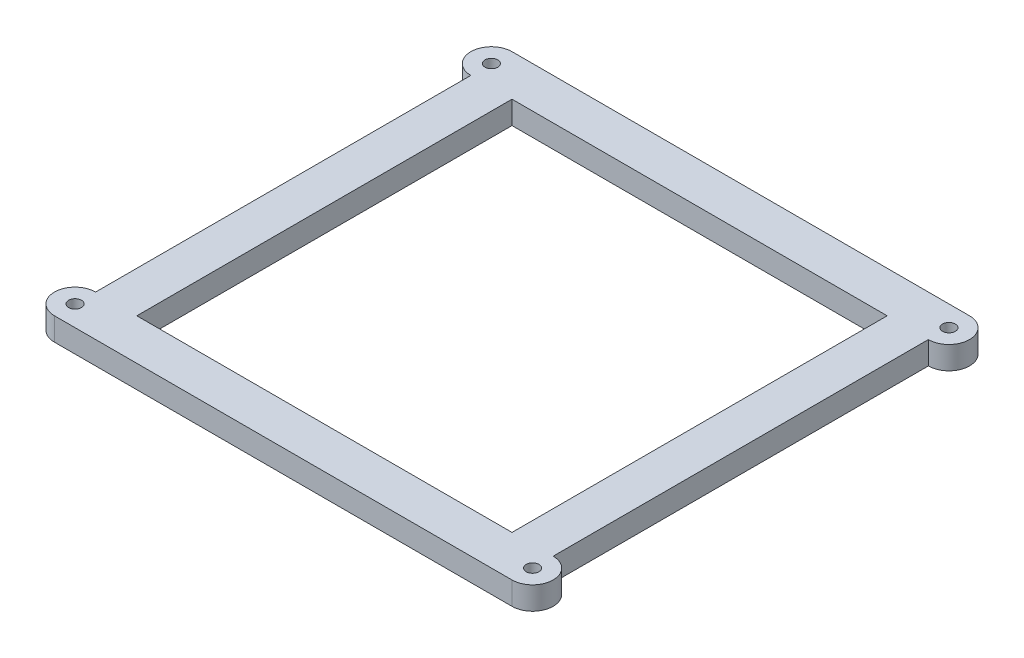
ISO-10303-21;
HEADER;
FILE_DESCRIPTION(('STEP AP214'),'2;1');
FILE_NAME('part.step','',(''),(''),'','','');
FILE_SCHEMA(('AUTOMOTIVE_DESIGN { 1 0 10303 214 1 1 1 1 }'));
ENDSEC;
DATA;
#1=APPLICATION_CONTEXT('core data for automotive mechanical design processes');
#2=APPLICATION_PROTOCOL_DEFINITION('international standard','automotive_design',2000,#1);
#3=PRODUCT_CONTEXT('',#1,'mechanical');
#4=PRODUCT('Part','Part','',(#3));
#5=PRODUCT_RELATED_PRODUCT_CATEGORY('part','',(#4));
#6=PRODUCT_DEFINITION_FORMATION('','',#4);
#7=PRODUCT_DEFINITION_CONTEXT('part definition',#1,'design');
#8=PRODUCT_DEFINITION('design','',#6,#7);
#9=PRODUCT_DEFINITION_SHAPE('','',#8);
#10=(LENGTH_UNIT() NAMED_UNIT(*) SI_UNIT(.MILLI.,.METRE.));
#11=(NAMED_UNIT(*) PLANE_ANGLE_UNIT() SI_UNIT($,.RADIAN.));
#12=(NAMED_UNIT(*) SI_UNIT($,.STERADIAN.) SOLID_ANGLE_UNIT());
#13=UNCERTAINTY_MEASURE_WITH_UNIT(LENGTH_MEASURE(1.E-05),#10,'distance_accuracy_value','');
#14=(GEOMETRIC_REPRESENTATION_CONTEXT(3) GLOBAL_UNCERTAINTY_ASSIGNED_CONTEXT((#13)) GLOBAL_UNIT_ASSIGNED_CONTEXT((#10,
#11,#12)) REPRESENTATION_CONTEXT('',''));
#15=CARTESIAN_POINT('',(0.,0.,0.));
#16=DIRECTION('',(0.,0.,1.));
#17=DIRECTION('',(1.,0.,0.));
#18=AXIS2_PLACEMENT_3D('',#15,#16,#17);
#19=CARTESIAN_POINT('',(0.,3.175,-2.8575));
#20=DIRECTION('',(0.,-1.,0.));
#21=DIRECTION('',(0.,0.,-1.));
#22=AXIS2_PLACEMENT_3D('',#19,#20,#21);
#23=PLANE('',#22);
#24=CARTESIAN_POINT('',(63.5,3.175,-60.6425));
#25=DIRECTION('',(0.,-1.,0.));
#26=DIRECTION('',(0.,0.,-1.));
#27=AXIS2_PLACEMENT_3D('',#24,#25,#26);
#28=CIRCLE('',#27,0.888636505741465);
#29=CARTESIAN_POINT('',(63.5,3.175,-61.5311365057415));
#30=VERTEX_POINT('',#29);
#31=EDGE_CURVE('E36',#30,#30,#28,.T.);
#32=ORIENTED_EDGE('',*,*,#31,.T.);
#33=EDGE_LOOP('',(#32));
#34=FACE_BOUND('',#33,.T.);
#35=CARTESIAN_POINT('',(0.,3.175,-60.6425));
#36=DIRECTION('',(0.,-1.,0.));
#37=DIRECTION('',(0.,0.,-1.));
#38=AXIS2_PLACEMENT_3D('',#35,#36,#37);
#39=CIRCLE('',#38,0.888636505741464);
#40=CARTESIAN_POINT('',(0.,3.175,-61.5311365057415));
#41=VERTEX_POINT('',#40);
#42=EDGE_CURVE('E221',#41,#41,#39,.T.);
#43=ORIENTED_EDGE('',*,*,#42,.T.);
#44=EDGE_LOOP('',(#43));
#45=FACE_BOUND('',#44,.T.);
#46=CARTESIAN_POINT('',(0.,3.175,-2.8575));
#47=DIRECTION('',(0.,-1.,0.));
#48=DIRECTION('',(0.,0.,-1.));
#49=AXIS2_PLACEMENT_3D('',#46,#47,#48);
#50=CIRCLE('',#49,0.888636505741464);
#51=CARTESIAN_POINT('',(0.,3.175,-3.74613650574146));
#52=VERTEX_POINT('',#51);
#53=EDGE_CURVE('E217',#52,#52,#50,.T.);
#54=ORIENTED_EDGE('',*,*,#53,.T.);
#55=EDGE_LOOP('',(#54));
#56=FACE_BOUND('',#55,.T.);
#57=CARTESIAN_POINT('',(63.5,3.175,-2.8575));
#58=DIRECTION('',(0.,-1.,0.));
#59=DIRECTION('',(0.,0.,-1.));
#60=AXIS2_PLACEMENT_3D('',#57,#58,#59);
#61=CIRCLE('',#60,0.888636505741465);
#62=CARTESIAN_POINT('',(63.5,3.175,-3.74613650574146));
#63=VERTEX_POINT('',#62);
#64=EDGE_CURVE('E151',#63,#63,#61,.T.);
#65=ORIENTED_EDGE('',*,*,#64,.T.);
#66=EDGE_LOOP('',(#65));
#67=FACE_BOUND('',#66,.T.);
#68=CARTESIAN_POINT('',(0.,3.175,-2.8575));
#69=DIRECTION('',(0.,1.,0.));
#70=DIRECTION('',(0.,0.,-1.));
#71=AXIS2_PLACEMENT_3D('',#68,#69,#70);
#72=CIRCLE('',#71,2.8575);
#73=CARTESIAN_POINT('',(0.,3.175,-5.715));
#74=VERTEX_POINT('',#73);
#75=CARTESIAN_POINT('',(0.,3.175,0.));
#76=VERTEX_POINT('',#75);
#77=EDGE_CURVE('E161',#74,#76,#72,.T.);
#78=ORIENTED_EDGE('',*,*,#77,.T.);
#79=DIRECTION('',(1.,0.,0.));
#80=VECTOR('',#79,1.);
#81=CARTESIAN_POINT('',(0.,3.175,0.));
#82=LINE('',#81,#80);
#83=CARTESIAN_POINT('',(63.5,3.175,0.));
#84=VERTEX_POINT('',#83);
#85=EDGE_CURVE('E164',#76,#84,#82,.T.);
#86=ORIENTED_EDGE('',*,*,#85,.T.);
#87=CARTESIAN_POINT('',(63.5,3.175,-2.8575));
#88=DIRECTION('',(0.,1.,0.));
#89=DIRECTION('',(0.,0.,1.));
#90=AXIS2_PLACEMENT_3D('',#87,#88,#89);
#91=CIRCLE('',#90,2.8575);
#92=CARTESIAN_POINT('',(63.5,3.175,-5.715));
#93=VERTEX_POINT('',#92);
#94=EDGE_CURVE('E167',#84,#93,#91,.T.);
#95=ORIENTED_EDGE('',*,*,#94,.T.);
#96=DIRECTION('',(0.,0.,-1.));
#97=VECTOR('',#96,1.);
#98=CARTESIAN_POINT('',(63.5,3.175,-5.715));
#99=LINE('',#98,#97);
#100=CARTESIAN_POINT('',(63.5,3.175,-57.785));
#101=VERTEX_POINT('',#100);
#102=EDGE_CURVE('E169',#93,#101,#99,.T.);
#103=ORIENTED_EDGE('',*,*,#102,.T.);
#104=CARTESIAN_POINT('',(63.5,3.175,-60.6425));
#105=DIRECTION('',(0.,1.,0.));
#106=DIRECTION('',(0.,0.,-1.));
#107=AXIS2_PLACEMENT_3D('',#104,#105,#106);
#108=CIRCLE('',#107,2.8575);
#109=CARTESIAN_POINT('',(63.5,3.175,-63.5));
#110=VERTEX_POINT('',#109);
#111=EDGE_CURVE('E171',#101,#110,#108,.T.);
#112=ORIENTED_EDGE('',*,*,#111,.T.);
#113=DIRECTION('',(-1.,0.,0.));
#114=VECTOR('',#113,1.);
#115=CARTESIAN_POINT('',(0.,3.175,-63.5));
#116=LINE('',#115,#114);
#117=CARTESIAN_POINT('',(0.,3.175,-63.5));
#118=VERTEX_POINT('',#117);
#119=EDGE_CURVE('E173',#110,#118,#116,.T.);
#120=ORIENTED_EDGE('',*,*,#119,.T.);
#121=CARTESIAN_POINT('',(0.,3.175,-60.6425));
#122=DIRECTION('',(0.,1.,0.));
#123=DIRECTION('',(0.,0.,1.));
#124=AXIS2_PLACEMENT_3D('',#121,#122,#123);
#125=CIRCLE('',#124,2.8575);
#126=CARTESIAN_POINT('',(0.,3.175,-57.785));
#127=VERTEX_POINT('',#126);
#128=EDGE_CURVE('E175',#118,#127,#125,.T.);
#129=ORIENTED_EDGE('',*,*,#128,.T.);
#130=DIRECTION('',(0.,0.,1.));
#131=VECTOR('',#130,1.);
#132=CARTESIAN_POINT('',(0.,3.175,-5.715));
#133=LINE('',#132,#131);
#134=EDGE_CURVE('E177',#127,#74,#133,.T.);
#135=ORIENTED_EDGE('',*,*,#134,.T.);
#136=EDGE_LOOP('',(#78,#86,#95,#103,#112,#120,#129,#135));
#137=FACE_BOUND('',#136,.T.);
#138=DIRECTION('',(0.,0.,-1.));
#139=VECTOR('',#138,1.);
#140=CARTESIAN_POINT('',(57.785,3.175,-5.71500000000001));
#141=LINE('',#140,#139);
#142=CARTESIAN_POINT('',(57.785,3.175,-5.71500000000001));
#143=VERTEX_POINT('',#142);
#144=CARTESIAN_POINT('',(57.785,3.175,-57.785));
#145=VERTEX_POINT('',#144);
#146=EDGE_CURVE('E123',#143,#145,#141,.T.);
#147=ORIENTED_EDGE('',*,*,#146,.F.);
#148=DIRECTION('',(1.,0.,0.));
#149=VECTOR('',#148,1.);
#150=CARTESIAN_POINT('',(5.71500000000001,3.175,-5.71500000000001));
#151=LINE('',#150,#149);
#152=CARTESIAN_POINT('',(5.71500000000001,3.175,-5.71500000000001));
#153=VERTEX_POINT('',#152);
#154=EDGE_CURVE('E145',#153,#143,#151,.T.);
#155=ORIENTED_EDGE('',*,*,#154,.F.);
#156=DIRECTION('',(0.,0.,1.));
#157=VECTOR('',#156,1.);
#158=CARTESIAN_POINT('',(5.71500000000001,3.175,-5.71500000000001));
#159=LINE('',#158,#157);
#160=CARTESIAN_POINT('',(5.71500000000001,3.175,-57.785));
#161=VERTEX_POINT('',#160);
#162=EDGE_CURVE('E143',#161,#153,#159,.T.);
#163=ORIENTED_EDGE('',*,*,#162,.F.);
#164=DIRECTION('',(-1.,0.,0.));
#165=VECTOR('',#164,1.);
#166=CARTESIAN_POINT('',(5.71500000000001,3.175,-57.785));
#167=LINE('',#166,#165);
#168=EDGE_CURVE('E131',#145,#161,#167,.T.);
#169=ORIENTED_EDGE('',*,*,#168,.F.);
#170=EDGE_LOOP('',(#147,#155,#163,#169));
#171=FACE_BOUND('',#170,.T.);
#172=ADVANCED_FACE('F32',(#34,#45,#56,#67,#137,#171),#23,.F.);
#173=CARTESIAN_POINT('',(0.,0.,-2.8575));
#174=DIRECTION('',(0.,-1.,0.));
#175=DIRECTION('',(0.,0.,-1.));
#176=AXIS2_PLACEMENT_3D('',#173,#174,#175);
#177=PLANE('',#176);
#178=CARTESIAN_POINT('',(63.5,0.,-60.6425));
#179=DIRECTION('',(0.,-1.,0.));
#180=DIRECTION('',(0.,0.,-1.));
#181=AXIS2_PLACEMENT_3D('',#178,#179,#180);
#182=CIRCLE('',#181,1.09999999999999);
#183=CARTESIAN_POINT('',(63.5,0.,-61.7425));
#184=VERTEX_POINT('',#183);
#185=EDGE_CURVE('E423',#184,#184,#182,.T.);
#186=ORIENTED_EDGE('',*,*,#185,.F.);
#187=EDGE_LOOP('',(#186));
#188=FACE_BOUND('',#187,.T.);
#189=CARTESIAN_POINT('',(0.,0.,-60.6425));
#190=DIRECTION('',(0.,-1.,0.));
#191=DIRECTION('',(0.,0.,-1.));
#192=AXIS2_PLACEMENT_3D('',#189,#190,#191);
#193=CIRCLE('',#192,1.09999999999999);
#194=CARTESIAN_POINT('',(0.,0.,-61.7425));
#195=VERTEX_POINT('',#194);
#196=EDGE_CURVE('E230',#195,#195,#193,.T.);
#197=ORIENTED_EDGE('',*,*,#196,.F.);
#198=EDGE_LOOP('',(#197));
#199=FACE_BOUND('',#198,.T.);
#200=CARTESIAN_POINT('',(0.,0.,-2.8575));
#201=DIRECTION('',(0.,-1.,0.));
#202=DIRECTION('',(0.,0.,-1.));
#203=AXIS2_PLACEMENT_3D('',#200,#201,#202);
#204=CIRCLE('',#203,1.09999999999999);
#205=CARTESIAN_POINT('',(0.,0.,-3.95749999999999));
#206=VERTEX_POINT('',#205);
#207=EDGE_CURVE('E223',#206,#206,#204,.T.);
#208=ORIENTED_EDGE('',*,*,#207,.F.);
#209=EDGE_LOOP('',(#208));
#210=FACE_BOUND('',#209,.T.);
#211=CARTESIAN_POINT('',(63.5,0.,-2.8575));
#212=DIRECTION('',(0.,-1.,0.));
#213=DIRECTION('',(0.,0.,-1.));
#214=AXIS2_PLACEMENT_3D('',#211,#212,#213);
#215=CIRCLE('',#214,1.09999999999999);
#216=CARTESIAN_POINT('',(63.5,0.,-3.95749999999999));
#217=VERTEX_POINT('',#216);
#218=EDGE_CURVE('E219',#217,#217,#215,.T.);
#219=ORIENTED_EDGE('',*,*,#218,.F.);
#220=EDGE_LOOP('',(#219));
#221=FACE_BOUND('',#220,.T.);
#222=CARTESIAN_POINT('',(0.,0.,-2.8575));
#223=DIRECTION('',(0.,1.,0.));
#224=DIRECTION('',(0.,0.,-1.));
#225=AXIS2_PLACEMENT_3D('',#222,#223,#224);
#226=CIRCLE('',#225,2.8575);
#227=CARTESIAN_POINT('',(0.,0.,-5.715));
#228=VERTEX_POINT('',#227);
#229=CARTESIAN_POINT('',(0.,0.,0.));
#230=VERTEX_POINT('',#229);
#231=EDGE_CURVE('E139',#228,#230,#226,.T.);
#232=ORIENTED_EDGE('',*,*,#231,.F.);
#233=DIRECTION('',(0.,0.,1.));
#234=VECTOR('',#233,1.);
#235=CARTESIAN_POINT('',(0.,0.,-5.715));
#236=LINE('',#235,#234);
#237=CARTESIAN_POINT('',(0.,0.,-57.785));
#238=VERTEX_POINT('',#237);
#239=EDGE_CURVE('E165',#238,#228,#236,.T.);
#240=ORIENTED_EDGE('',*,*,#239,.F.);
#241=CARTESIAN_POINT('',(0.,0.,-60.6425));
#242=DIRECTION('',(0.,1.,0.));
#243=DIRECTION('',(0.,0.,1.));
#244=AXIS2_PLACEMENT_3D('',#241,#242,#243);
#245=CIRCLE('',#244,2.8575);
#246=CARTESIAN_POINT('',(0.,0.,-63.5));
#247=VERTEX_POINT('',#246);
#248=EDGE_CURVE('E192',#247,#238,#245,.T.);
#249=ORIENTED_EDGE('',*,*,#248,.F.);
#250=DIRECTION('',(-1.,0.,0.));
#251=VECTOR('',#250,1.);
#252=CARTESIAN_POINT('',(0.,0.,-63.5));
#253=LINE('',#252,#251);
#254=CARTESIAN_POINT('',(63.5,0.,-63.5));
#255=VERTEX_POINT('',#254);
#256=EDGE_CURVE('E190',#255,#247,#253,.T.);
#257=ORIENTED_EDGE('',*,*,#256,.F.);
#258=CARTESIAN_POINT('',(63.5,0.,-60.6425));
#259=DIRECTION('',(0.,1.,0.));
#260=DIRECTION('',(0.,0.,-1.));
#261=AXIS2_PLACEMENT_3D('',#258,#259,#260);
#262=CIRCLE('',#261,2.8575);
#263=CARTESIAN_POINT('',(63.5,0.,-57.785));
#264=VERTEX_POINT('',#263);
#265=EDGE_CURVE('E188',#264,#255,#262,.T.);
#266=ORIENTED_EDGE('',*,*,#265,.F.);
#267=DIRECTION('',(0.,0.,-1.));
#268=VECTOR('',#267,1.);
#269=CARTESIAN_POINT('',(63.5,0.,-5.715));
#270=LINE('',#269,#268);
#271=CARTESIAN_POINT('',(63.5,0.,-5.715));
#272=VERTEX_POINT('',#271);
#273=EDGE_CURVE('E186',#272,#264,#270,.T.);
#274=ORIENTED_EDGE('',*,*,#273,.F.);
#275=CARTESIAN_POINT('',(63.5,0.,-2.8575));
#276=DIRECTION('',(0.,1.,0.));
#277=DIRECTION('',(0.,0.,1.));
#278=AXIS2_PLACEMENT_3D('',#275,#276,#277);
#279=CIRCLE('',#278,2.8575);
#280=CARTESIAN_POINT('',(63.5,0.,0.));
#281=VERTEX_POINT('',#280);
#282=EDGE_CURVE('E184',#281,#272,#279,.T.);
#283=ORIENTED_EDGE('',*,*,#282,.F.);
#284=DIRECTION('',(1.,0.,0.));
#285=VECTOR('',#284,1.);
#286=CARTESIAN_POINT('',(0.,0.,0.));
#287=LINE('',#286,#285);
#288=EDGE_CURVE('E182',#230,#281,#287,.T.);
#289=ORIENTED_EDGE('',*,*,#288,.F.);
#290=EDGE_LOOP('',(#232,#240,#249,#257,#266,#274,#283,#289));
#291=FACE_BOUND('',#290,.T.);
#292=DIRECTION('',(1.,0.,0.));
#293=VECTOR('',#292,1.);
#294=CARTESIAN_POINT('',(5.71500000000001,0.,-5.71500000000001));
#295=LINE('',#294,#293);
#296=CARTESIAN_POINT('',(5.71500000000001,0.,-5.71500000000001));
#297=VERTEX_POINT('',#296);
#298=CARTESIAN_POINT('',(57.785,0.,-5.71500000000001));
#299=VERTEX_POINT('',#298);
#300=EDGE_CURVE('E132',#297,#299,#295,.T.);
#301=ORIENTED_EDGE('',*,*,#300,.T.);
#302=DIRECTION('',(0.,0.,-1.));
#303=VECTOR('',#302,1.);
#304=CARTESIAN_POINT('',(57.785,0.,-5.71500000000001));
#305=LINE('',#304,#303);
#306=CARTESIAN_POINT('',(57.785,0.,-57.785));
#307=VERTEX_POINT('',#306);
#308=EDGE_CURVE('E57',#299,#307,#305,.T.);
#309=ORIENTED_EDGE('',*,*,#308,.T.);
#310=DIRECTION('',(-1.,0.,0.));
#311=VECTOR('',#310,1.);
#312=CARTESIAN_POINT('',(5.71500000000001,0.,-57.785));
#313=LINE('',#312,#311);
#314=CARTESIAN_POINT('',(5.71500000000001,0.,-57.785));
#315=VERTEX_POINT('',#314);
#316=EDGE_CURVE('E138',#307,#315,#313,.T.);
#317=ORIENTED_EDGE('',*,*,#316,.T.);
#318=DIRECTION('',(0.,0.,1.));
#319=VECTOR('',#318,1.);
#320=CARTESIAN_POINT('',(5.71500000000001,0.,-5.71500000000001));
#321=LINE('',#320,#319);
#322=EDGE_CURVE('E153',#315,#297,#321,.T.);
#323=ORIENTED_EDGE('',*,*,#322,.T.);
#324=EDGE_LOOP('',(#301,#309,#317,#323));
#325=FACE_BOUND('',#324,.T.);
#326=ADVANCED_FACE('F254',(#188,#199,#210,#221,#291,#325),#177,.T.);
#327=CARTESIAN_POINT('',(0.,3.175,-2.8575));
#328=DIRECTION('',(0.,-1.,0.));
#329=DIRECTION('',(0.,0.,-1.));
#330=AXIS2_PLACEMENT_3D('',#327,#328,#329);
#331=CYLINDRICAL_SURFACE('',#330,2.8575);
#332=ORIENTED_EDGE('',*,*,#231,.T.);
#333=DIRECTION('',(0.,-1.,0.));
#334=VECTOR('',#333,1.);
#335=CARTESIAN_POINT('',(0.,3.175,0.));
#336=LINE('',#335,#334);
#337=EDGE_CURVE('E11',#76,#230,#336,.T.);
#338=ORIENTED_EDGE('',*,*,#337,.F.);
#339=ORIENTED_EDGE('',*,*,#77,.F.);
#340=DIRECTION('',(0.,-1.,0.));
#341=VECTOR('',#340,1.);
#342=CARTESIAN_POINT('',(0.,3.175,-5.715));
#343=LINE('',#342,#341);
#344=EDGE_CURVE('E179',#74,#228,#343,.T.);
#345=ORIENTED_EDGE('',*,*,#344,.T.);
#346=EDGE_LOOP('',(#332,#338,#339,#345));
#347=FACE_BOUND('',#346,.T.);
#348=ADVANCED_FACE('F34',(#347),#331,.T.);
#349=CARTESIAN_POINT('',(0.,3.175,0.));
#350=DIRECTION('',(0.,0.,-1.));
#351=DIRECTION('',(-1.,0.,0.));
#352=AXIS2_PLACEMENT_3D('',#349,#350,#351);
#353=PLANE('',#352);
#354=ORIENTED_EDGE('',*,*,#288,.T.);
#355=DIRECTION('',(0.,-1.,0.));
#356=VECTOR('',#355,1.);
#357=CARTESIAN_POINT('',(63.5,3.175,0.));
#358=LINE('',#357,#356);
#359=EDGE_CURVE('E41',#84,#281,#358,.T.);
#360=ORIENTED_EDGE('',*,*,#359,.F.);
#361=ORIENTED_EDGE('',*,*,#85,.F.);
#362=ORIENTED_EDGE('',*,*,#337,.T.);
#363=EDGE_LOOP('',(#354,#360,#361,#362));
#364=FACE_BOUND('',#363,.T.);
#365=ADVANCED_FACE('F305',(#364),#353,.F.);
#366=CARTESIAN_POINT('',(63.5,3.175,-2.8575));
#367=DIRECTION('',(0.,-1.,0.));
#368=DIRECTION('',(0.,0.,-1.));
#369=AXIS2_PLACEMENT_3D('',#366,#367,#368);
#370=CYLINDRICAL_SURFACE('',#369,2.8575);
#371=ORIENTED_EDGE('',*,*,#282,.T.);
#372=DIRECTION('',(0.,-1.,0.));
#373=VECTOR('',#372,1.);
#374=CARTESIAN_POINT('',(63.5,3.175,-5.715));
#375=LINE('',#374,#373);
#376=EDGE_CURVE('E209',#93,#272,#375,.T.);
#377=ORIENTED_EDGE('',*,*,#376,.F.);
#378=ORIENTED_EDGE('',*,*,#94,.F.);
#379=ORIENTED_EDGE('',*,*,#359,.T.);
#380=EDGE_LOOP('',(#371,#377,#378,#379));
#381=FACE_BOUND('',#380,.T.);
#382=ADVANCED_FACE('F302',(#381),#370,.T.);
#383=CARTESIAN_POINT('',(63.5,3.175,-5.715));
#384=DIRECTION('',(-1.,0.,0.));
#385=DIRECTION('',(0.,0.,1.));
#386=AXIS2_PLACEMENT_3D('',#383,#384,#385);
#387=PLANE('',#386);
#388=ORIENTED_EDGE('',*,*,#273,.T.);
#389=DIRECTION('',(0.,-1.,0.));
#390=VECTOR('',#389,1.);
#391=CARTESIAN_POINT('',(63.5,3.175,-57.785));
#392=LINE('',#391,#390);
#393=EDGE_CURVE('E206',#101,#264,#392,.T.);
#394=ORIENTED_EDGE('',*,*,#393,.F.);
#395=ORIENTED_EDGE('',*,*,#102,.F.);
#396=ORIENTED_EDGE('',*,*,#376,.T.);
#397=EDGE_LOOP('',(#388,#394,#395,#396));
#398=FACE_BOUND('',#397,.T.);
#399=ADVANCED_FACE('F298',(#398),#387,.F.);
#400=CARTESIAN_POINT('',(63.5,3.175,-60.6425));
#401=DIRECTION('',(0.,-1.,0.));
#402=DIRECTION('',(0.,0.,-1.));
#403=AXIS2_PLACEMENT_3D('',#400,#401,#402);
#404=CYLINDRICAL_SURFACE('',#403,2.8575);
#405=ORIENTED_EDGE('',*,*,#265,.T.);
#406=DIRECTION('',(0.,-1.,0.));
#407=VECTOR('',#406,1.);
#408=CARTESIAN_POINT('',(63.5,3.175,-63.5));
#409=LINE('',#408,#407);
#410=EDGE_CURVE('E203',#110,#255,#409,.T.);
#411=ORIENTED_EDGE('',*,*,#410,.F.);
#412=ORIENTED_EDGE('',*,*,#111,.F.);
#413=ORIENTED_EDGE('',*,*,#393,.T.);
#414=EDGE_LOOP('',(#405,#411,#412,#413));
#415=FACE_BOUND('',#414,.T.);
#416=ADVANCED_FACE('F294',(#415),#404,.T.);
#417=CARTESIAN_POINT('',(0.,3.175,-63.5));
#418=DIRECTION('',(0.,0.,1.));
#419=DIRECTION('',(1.,0.,0.));
#420=AXIS2_PLACEMENT_3D('',#417,#418,#419);
#421=PLANE('',#420);
#422=ORIENTED_EDGE('',*,*,#256,.T.);
#423=DIRECTION('',(0.,-1.,0.));
#424=VECTOR('',#423,1.);
#425=CARTESIAN_POINT('',(0.,3.175,-63.5));
#426=LINE('',#425,#424);
#427=EDGE_CURVE('E200',#118,#247,#426,.T.);
#428=ORIENTED_EDGE('',*,*,#427,.F.);
#429=ORIENTED_EDGE('',*,*,#119,.F.);
#430=ORIENTED_EDGE('',*,*,#410,.T.);
#431=EDGE_LOOP('',(#422,#428,#429,#430));
#432=FACE_BOUND('',#431,.T.);
#433=ADVANCED_FACE('F290',(#432),#421,.F.);
#434=CARTESIAN_POINT('',(0.,3.175,-60.6425));
#435=DIRECTION('',(0.,-1.,0.));
#436=DIRECTION('',(0.,0.,-1.));
#437=AXIS2_PLACEMENT_3D('',#434,#435,#436);
#438=CYLINDRICAL_SURFACE('',#437,2.8575);
#439=ORIENTED_EDGE('',*,*,#248,.T.);
#440=DIRECTION('',(0.,-1.,0.));
#441=VECTOR('',#440,1.);
#442=CARTESIAN_POINT('',(0.,3.175,-57.785));
#443=LINE('',#442,#441);
#444=EDGE_CURVE('E197',#127,#238,#443,.T.);
#445=ORIENTED_EDGE('',*,*,#444,.F.);
#446=ORIENTED_EDGE('',*,*,#128,.F.);
#447=ORIENTED_EDGE('',*,*,#427,.T.);
#448=EDGE_LOOP('',(#439,#445,#446,#447));
#449=FACE_BOUND('',#448,.T.);
#450=ADVANCED_FACE('F286',(#449),#438,.T.);
#451=CARTESIAN_POINT('',(0.,3.175,-5.715));
#452=DIRECTION('',(1.,0.,0.));
#453=DIRECTION('',(0.,0.,-1.));
#454=AXIS2_PLACEMENT_3D('',#451,#452,#453);
#455=PLANE('',#454);
#456=ORIENTED_EDGE('',*,*,#239,.T.);
#457=ORIENTED_EDGE('',*,*,#344,.F.);
#458=ORIENTED_EDGE('',*,*,#134,.F.);
#459=ORIENTED_EDGE('',*,*,#444,.T.);
#460=EDGE_LOOP('',(#456,#457,#458,#459));
#461=FACE_BOUND('',#460,.T.);
#462=ADVANCED_FACE('F283',(#461),#455,.F.);
#463=CARTESIAN_POINT('',(57.785,3.175,-5.71500000000001));
#464=DIRECTION('',(-1.,0.,0.));
#465=DIRECTION('',(0.,0.,1.));
#466=AXIS2_PLACEMENT_3D('',#463,#464,#465);
#467=PLANE('',#466);
#468=ORIENTED_EDGE('',*,*,#308,.F.);
#469=DIRECTION('',(0.,-1.,0.));
#470=VECTOR('',#469,1.);
#471=CARTESIAN_POINT('',(57.785,3.175,-5.71500000000001));
#472=LINE('',#471,#470);
#473=EDGE_CURVE('E127',#143,#299,#472,.T.);
#474=ORIENTED_EDGE('',*,*,#473,.F.);
#475=ORIENTED_EDGE('',*,*,#146,.T.);
#476=DIRECTION('',(0.,-1.,0.));
#477=VECTOR('',#476,1.);
#478=CARTESIAN_POINT('',(57.785,3.175,-57.785));
#479=LINE('',#478,#477);
#480=EDGE_CURVE('E126',#145,#307,#479,.T.);
#481=ORIENTED_EDGE('',*,*,#480,.T.);
#482=EDGE_LOOP('',(#468,#474,#475,#481));
#483=FACE_BOUND('',#482,.T.);
#484=ADVANCED_FACE('F125',(#483),#467,.T.);
#485=CARTESIAN_POINT('',(5.71500000000001,3.175,-57.785));
#486=DIRECTION('',(0.,0.,1.));
#487=DIRECTION('',(1.,0.,0.));
#488=AXIS2_PLACEMENT_3D('',#485,#486,#487);
#489=PLANE('',#488);
#490=ORIENTED_EDGE('',*,*,#316,.F.);
#491=ORIENTED_EDGE('',*,*,#480,.F.);
#492=ORIENTED_EDGE('',*,*,#168,.T.);
#493=DIRECTION('',(0.,-1.,0.));
#494=VECTOR('',#493,1.);
#495=CARTESIAN_POINT('',(5.71500000000001,3.175,-57.785));
#496=LINE('',#495,#494);
#497=EDGE_CURVE('E140',#161,#315,#496,.T.);
#498=ORIENTED_EDGE('',*,*,#497,.T.);
#499=EDGE_LOOP('',(#490,#491,#492,#498));
#500=FACE_BOUND('',#499,.T.);
#501=ADVANCED_FACE('F135',(#500),#489,.T.);
#502=CARTESIAN_POINT('',(5.71500000000001,3.175,-5.71500000000001));
#503=DIRECTION('',(1.,0.,0.));
#504=DIRECTION('',(0.,0.,-1.));
#505=AXIS2_PLACEMENT_3D('',#502,#503,#504);
#506=PLANE('',#505);
#507=ORIENTED_EDGE('',*,*,#322,.F.);
#508=ORIENTED_EDGE('',*,*,#497,.F.);
#509=ORIENTED_EDGE('',*,*,#162,.T.);
#510=DIRECTION('',(0.,-1.,0.));
#511=VECTOR('',#510,1.);
#512=CARTESIAN_POINT('',(5.71500000000001,3.175,-5.71500000000001));
#513=LINE('',#512,#511);
#514=EDGE_CURVE('E49',#153,#297,#513,.T.);
#515=ORIENTED_EDGE('',*,*,#514,.T.);
#516=EDGE_LOOP('',(#507,#508,#509,#515));
#517=FACE_BOUND('',#516,.T.);
#518=ADVANCED_FACE('F265',(#517),#506,.T.);
#519=CARTESIAN_POINT('',(5.71500000000001,3.175,-5.71500000000001));
#520=DIRECTION('',(0.,0.,-1.));
#521=DIRECTION('',(-1.,0.,0.));
#522=AXIS2_PLACEMENT_3D('',#519,#520,#521);
#523=PLANE('',#522);
#524=ORIENTED_EDGE('',*,*,#300,.F.);
#525=ORIENTED_EDGE('',*,*,#514,.F.);
#526=ORIENTED_EDGE('',*,*,#154,.T.);
#527=ORIENTED_EDGE('',*,*,#473,.T.);
#528=EDGE_LOOP('',(#524,#525,#526,#527));
#529=FACE_BOUND('',#528,.T.);
#530=ADVANCED_FACE('F263',(#529),#523,.T.);
#531=CARTESIAN_POINT('',(63.5,3.048,-2.8575));
#532=DIRECTION('',(0.,-1.,0.));
#533=DIRECTION('',(0.,0.,-1.));
#534=AXIS2_PLACEMENT_3D('',#531,#532,#533);
#535=CONICAL_SURFACE('',#534,1.09999999999999,1.02974425867666);
#536=CARTESIAN_POINT('',(63.5,3.048,-2.8575));
#537=DIRECTION('',(0.,-1.,0.));
#538=DIRECTION('',(0.,0.,-1.));
#539=AXIS2_PLACEMENT_3D('',#536,#537,#538);
#540=CIRCLE('',#539,1.09999999999999);
#541=CARTESIAN_POINT('',(63.5,3.048,-3.95749999999999));
#542=VERTEX_POINT('',#541);
#543=EDGE_CURVE('E216',#542,#542,#540,.T.);
#544=ORIENTED_EDGE('',*,*,#543,.T.);
#545=EDGE_LOOP('',(#544));
#546=FACE_BOUND('',#545,.T.);
#547=ORIENTED_EDGE('',*,*,#64,.F.);
#548=EDGE_LOOP('',(#547));
#549=FACE_BOUND('',#548,.T.);
#550=ADVANCED_FACE('F244',(#546,#549),#535,.F.);
#551=CARTESIAN_POINT('',(63.5,0.,-2.8575));
#552=DIRECTION('',(0.,-1.,0.));
#553=DIRECTION('',(0.,0.,-1.));
#554=AXIS2_PLACEMENT_3D('',#551,#552,#553);
#555=CYLINDRICAL_SURFACE('',#554,1.09999999999999);
#556=ORIENTED_EDGE('',*,*,#543,.F.);
#557=EDGE_LOOP('',(#556));
#558=FACE_BOUND('',#557,.T.);
#559=ORIENTED_EDGE('',*,*,#218,.T.);
#560=EDGE_LOOP('',(#559));
#561=FACE_BOUND('',#560,.T.);
#562=ADVANCED_FACE('F247',(#558,#561),#555,.F.);
#563=CARTESIAN_POINT('',(0.,3.048,-2.8575));
#564=DIRECTION('',(0.,-1.,0.));
#565=DIRECTION('',(0.,0.,-1.));
#566=AXIS2_PLACEMENT_3D('',#563,#564,#565);
#567=CONICAL_SURFACE('',#566,1.09999999999999,1.02974425867665);
#568=CARTESIAN_POINT('',(0.,3.048,-2.8575));
#569=DIRECTION('',(0.,-1.,0.));
#570=DIRECTION('',(0.,0.,-1.));
#571=AXIS2_PLACEMENT_3D('',#568,#569,#570);
#572=CIRCLE('',#571,1.09999999999999);
#573=CARTESIAN_POINT('',(0.,3.048,-3.95749999999999));
#574=VERTEX_POINT('',#573);
#575=EDGE_CURVE('E220',#574,#574,#572,.T.);
#576=ORIENTED_EDGE('',*,*,#575,.T.);
#577=EDGE_LOOP('',(#576));
#578=FACE_BOUND('',#577,.T.);
#579=ORIENTED_EDGE('',*,*,#53,.F.);
#580=EDGE_LOOP('',(#579));
#581=FACE_BOUND('',#580,.T.);
#582=ADVANCED_FACE('F250',(#578,#581),#567,.F.);
#583=CARTESIAN_POINT('',(0.,0.,-2.8575));
#584=DIRECTION('',(0.,-1.,0.));
#585=DIRECTION('',(0.,0.,-1.));
#586=AXIS2_PLACEMENT_3D('',#583,#584,#585);
#587=CYLINDRICAL_SURFACE('',#586,1.09999999999999);
#588=ORIENTED_EDGE('',*,*,#575,.F.);
#589=EDGE_LOOP('',(#588));
#590=FACE_BOUND('',#589,.T.);
#591=ORIENTED_EDGE('',*,*,#207,.T.);
#592=EDGE_LOOP('',(#591));
#593=FACE_BOUND('',#592,.T.);
#594=ADVANCED_FACE('F364',(#590,#593),#587,.F.);
#595=CARTESIAN_POINT('',(0.,3.048,-60.6425));
#596=DIRECTION('',(0.,-1.,0.));
#597=DIRECTION('',(0.,0.,-1.));
#598=AXIS2_PLACEMENT_3D('',#595,#596,#597);
#599=CONICAL_SURFACE('',#598,1.09999999999999,1.02974425867665);
#600=CARTESIAN_POINT('',(0.,3.048,-60.6425));
#601=DIRECTION('',(0.,-1.,0.));
#602=DIRECTION('',(0.,0.,-1.));
#603=AXIS2_PLACEMENT_3D('',#600,#601,#602);
#604=CIRCLE('',#603,1.09999999999999);
#605=CARTESIAN_POINT('',(0.,3.048,-61.7425));
#606=VERTEX_POINT('',#605);
#607=EDGE_CURVE('E224',#606,#606,#604,.T.);
#608=ORIENTED_EDGE('',*,*,#607,.T.);
#609=EDGE_LOOP('',(#608));
#610=FACE_BOUND('',#609,.T.);
#611=ORIENTED_EDGE('',*,*,#42,.F.);
#612=EDGE_LOOP('',(#611));
#613=FACE_BOUND('',#612,.T.);
#614=ADVANCED_FACE('F374',(#610,#613),#599,.F.);
#615=CARTESIAN_POINT('',(0.,0.,-60.6425));
#616=DIRECTION('',(0.,-1.,0.));
#617=DIRECTION('',(0.,0.,-1.));
#618=AXIS2_PLACEMENT_3D('',#615,#616,#617);
#619=CYLINDRICAL_SURFACE('',#618,1.09999999999999);
#620=ORIENTED_EDGE('',*,*,#607,.F.);
#621=EDGE_LOOP('',(#620));
#622=FACE_BOUND('',#621,.T.);
#623=ORIENTED_EDGE('',*,*,#196,.T.);
#624=EDGE_LOOP('',(#623));
#625=FACE_BOUND('',#624,.T.);
#626=ADVANCED_FACE('F384',(#622,#625),#619,.F.);
#627=CARTESIAN_POINT('',(63.5,3.048,-60.6425));
#628=DIRECTION('',(0.,-1.,0.));
#629=DIRECTION('',(0.,0.,-1.));
#630=AXIS2_PLACEMENT_3D('',#627,#628,#629);
#631=CONICAL_SURFACE('',#630,1.09999999999999,1.02974425867666);
#632=CARTESIAN_POINT('',(63.5,3.048,-60.6425));
#633=DIRECTION('',(0.,-1.,0.));
#634=DIRECTION('',(0.,0.,-1.));
#635=AXIS2_PLACEMENT_3D('',#632,#633,#634);
#636=CIRCLE('',#635,1.09999999999999);
#637=CARTESIAN_POINT('',(63.5,3.048,-61.7425));
#638=VERTEX_POINT('',#637);
#639=EDGE_CURVE('E420',#638,#638,#636,.T.);
#640=ORIENTED_EDGE('',*,*,#639,.T.);
#641=EDGE_LOOP('',(#640));
#642=FACE_BOUND('',#641,.T.);
#643=ORIENTED_EDGE('',*,*,#31,.F.);
#644=EDGE_LOOP('',(#643));
#645=FACE_BOUND('',#644,.T.);
#646=ADVANCED_FACE('F393',(#642,#645),#631,.F.);
#647=CARTESIAN_POINT('',(63.5,0.,-60.6425));
#648=DIRECTION('',(0.,-1.,0.));
#649=DIRECTION('',(0.,0.,-1.));
#650=AXIS2_PLACEMENT_3D('',#647,#648,#649);
#651=CYLINDRICAL_SURFACE('',#650,1.09999999999999);
#652=ORIENTED_EDGE('',*,*,#639,.F.);
#653=EDGE_LOOP('',(#652));
#654=FACE_BOUND('',#653,.T.);
#655=ORIENTED_EDGE('',*,*,#185,.T.);
#656=EDGE_LOOP('',(#655));
#657=FACE_BOUND('',#656,.T.);
#658=ADVANCED_FACE('F403',(#654,#657),#651,.F.);
#659=CLOSED_SHELL('',(#172,#326,#348,#365,#382,#399,#416,#433,#450,#462,#484,#501,#518,#530,
#550,#562,#582,#594,#614,#626,#646,#658));
#660=MANIFOLD_SOLID_BREP('B2',#659);
#661=ADVANCED_BREP_SHAPE_REPRESENTATION('',(#18,#660),#14);
#662=SHAPE_DEFINITION_REPRESENTATION(#9,#661);
ENDSEC;
END-ISO-10303-21;
